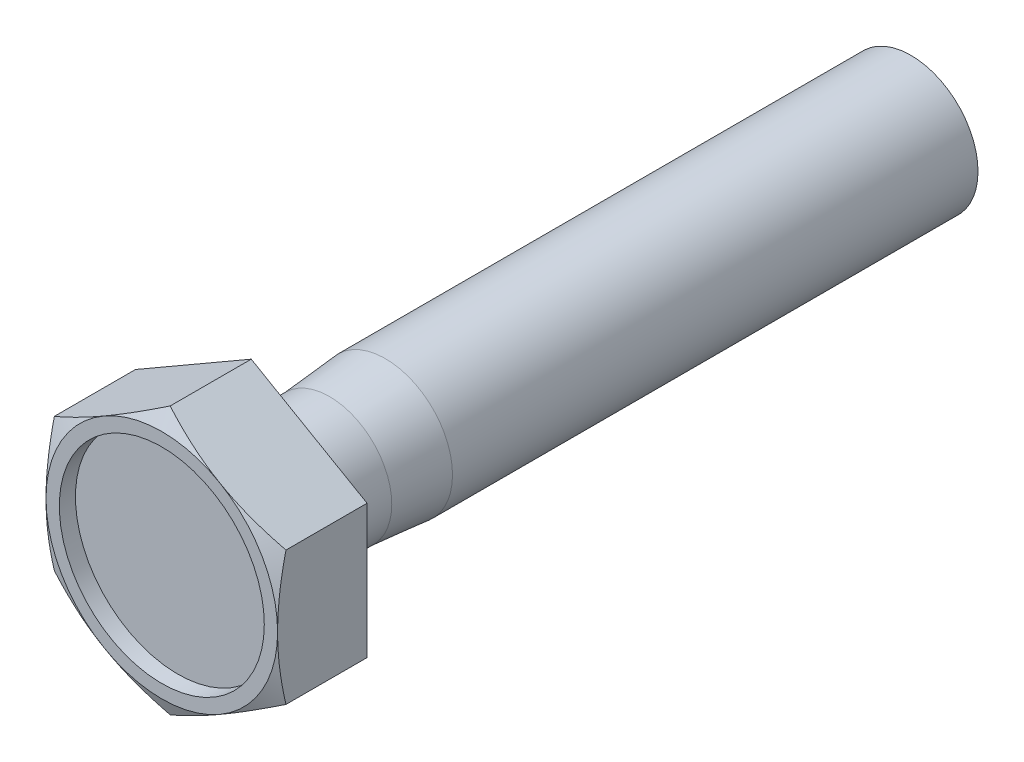
ISO-10303-21;
HEADER;
FILE_DESCRIPTION(('STEP AP214'),'2;1');
FILE_NAME('part.step','',(''),(''),'','','');
FILE_SCHEMA(('AUTOMOTIVE_DESIGN { 1 0 10303 214 1 1 1 1 }'));
ENDSEC;
DATA;
#1=APPLICATION_CONTEXT('core data for automotive mechanical design processes');
#2=APPLICATION_PROTOCOL_DEFINITION('international standard','automotive_design',2000,#1);
#3=PRODUCT_CONTEXT('',#1,'mechanical');
#4=PRODUCT('Part','Part','',(#3));
#5=PRODUCT_RELATED_PRODUCT_CATEGORY('part','',(#4));
#6=PRODUCT_DEFINITION_FORMATION('','',#4);
#7=PRODUCT_DEFINITION_CONTEXT('part definition',#1,'design');
#8=PRODUCT_DEFINITION('design','',#6,#7);
#9=PRODUCT_DEFINITION_SHAPE('','',#8);
#10=(LENGTH_UNIT() NAMED_UNIT(*) SI_UNIT(.MILLI.,.METRE.));
#11=(NAMED_UNIT(*) PLANE_ANGLE_UNIT() SI_UNIT($,.RADIAN.));
#12=(NAMED_UNIT(*) SI_UNIT($,.STERADIAN.) SOLID_ANGLE_UNIT());
#13=UNCERTAINTY_MEASURE_WITH_UNIT(LENGTH_MEASURE(1.E-05),#10,'distance_accuracy_value','');
#14=(GEOMETRIC_REPRESENTATION_CONTEXT(3) GLOBAL_UNCERTAINTY_ASSIGNED_CONTEXT((#13)) GLOBAL_UNIT_ASSIGNED_CONTEXT((#10,
#11,#12)) REPRESENTATION_CONTEXT('',''));
#15=CARTESIAN_POINT('',(0.,0.,0.));
#16=DIRECTION('',(0.,0.,1.));
#17=DIRECTION('',(1.,0.,0.));
#18=AXIS2_PLACEMENT_3D('',#15,#16,#17);
#19=CARTESIAN_POINT('',(2.58941595731547,-1.495,0.));
#20=DIRECTION('',(0.,0.,1.));
#21=DIRECTION('',(1.,0.,0.));
#22=AXIS2_PLACEMENT_3D('',#19,#20,#21);
#23=PLANE('',#22);
#24=CARTESIAN_POINT('',(0.,0.,0.));
#25=DIRECTION('',(0.,0.,1.));
#26=DIRECTION('',(1.,0.,0.));
#27=AXIS2_PLACEMENT_3D('',#24,#25,#26);
#28=CIRCLE('',#27,1.49175);
#29=CARTESIAN_POINT('',(1.49175,0.,0.));
#30=VERTEX_POINT('',#29);
#31=EDGE_CURVE('E12',#30,#30,#28,.T.);
#32=ORIENTED_EDGE('',*,*,#31,.T.);
#33=EDGE_LOOP('',(#32));
#34=FACE_BOUND('',#33,.T.);
#35=DIRECTION('',(0.866025403784439,0.5,0.));
#36=VECTOR('',#35,1.);
#37=CARTESIAN_POINT('',(0.,-2.99,0.));
#38=LINE('',#37,#36);
#39=CARTESIAN_POINT('',(0.,-2.99,0.));
#40=VERTEX_POINT('',#39);
#41=CARTESIAN_POINT('',(2.58941595731547,-1.495,0.));
#42=VERTEX_POINT('',#41);
#43=EDGE_CURVE('E222',#40,#42,#38,.T.);
#44=ORIENTED_EDGE('',*,*,#43,.F.);
#45=DIRECTION('',(0.866025403784439,-0.5,0.));
#46=VECTOR('',#45,1.);
#47=CARTESIAN_POINT('',(-2.58941595731547,-1.495,0.));
#48=LINE('',#47,#46);
#49=CARTESIAN_POINT('',(-2.58941595731547,-1.495,0.));
#50=VERTEX_POINT('',#49);
#51=EDGE_CURVE('E225',#50,#40,#48,.T.);
#52=ORIENTED_EDGE('',*,*,#51,.F.);
#53=DIRECTION('',(0.,-1.,0.));
#54=VECTOR('',#53,1.);
#55=CARTESIAN_POINT('',(-2.58941595731547,1.495,0.));
#56=LINE('',#55,#54);
#57=CARTESIAN_POINT('',(-2.58941595731547,1.495,0.));
#58=VERTEX_POINT('',#57);
#59=EDGE_CURVE('E238',#58,#50,#56,.T.);
#60=ORIENTED_EDGE('',*,*,#59,.F.);
#61=DIRECTION('',(-0.866025403784439,-0.5,0.));
#62=VECTOR('',#61,1.);
#63=CARTESIAN_POINT('',(0.,2.99,0.));
#64=LINE('',#63,#62);
#65=CARTESIAN_POINT('',(0.,2.99,0.));
#66=VERTEX_POINT('',#65);
#67=EDGE_CURVE('E235',#66,#58,#64,.T.);
#68=ORIENTED_EDGE('',*,*,#67,.F.);
#69=DIRECTION('',(-0.866025403784439,0.5,0.));
#70=VECTOR('',#69,1.);
#71=CARTESIAN_POINT('',(2.58941595731547,1.495,0.));
#72=LINE('',#71,#70);
#73=CARTESIAN_POINT('',(2.58941595731547,1.495,0.));
#74=VERTEX_POINT('',#73);
#75=EDGE_CURVE('E231',#74,#66,#72,.T.);
#76=ORIENTED_EDGE('',*,*,#75,.F.);
#77=DIRECTION('',(0.,1.,0.));
#78=VECTOR('',#77,1.);
#79=CARTESIAN_POINT('',(2.58941595731547,-1.495,0.));
#80=LINE('',#79,#78);
#81=EDGE_CURVE('E228',#42,#74,#80,.T.);
#82=ORIENTED_EDGE('',*,*,#81,.F.);
#83=EDGE_LOOP('',(#44,#52,#60,#68,#76,#82));
#84=FACE_BOUND('',#83,.T.);
#85=ADVANCED_FACE('F40',(#34,#84),#23,.F.);
#86=CARTESIAN_POINT('',(0.,-2.99,2.));
#87=DIRECTION('',(-0.5,0.866025403784439,0.));
#88=DIRECTION('',(-0.866025403784439,-0.5,0.));
#89=AXIS2_PLACEMENT_3D('',#86,#87,#88);
#90=PLANE('',#89);
#91=CARTESIAN_POINT('',(-0.000200000000000559,-2.99011547005384,1.81315074547213));
#92=CARTESIAN_POINT('',(0.0781117553372653,-2.94490215702915,1.83423550833601));
#93=CARTESIAN_POINT('',(0.156712474604209,-2.89952201060189,1.85396640188176));
#94=CARTESIAN_POINT('',(0.314503791686666,-2.80842115120854,1.89025045260236));
#95=CARTESIAN_POINT('',(0.393694684751058,-2.76270026778045,1.90680189036158));
#96=CARTESIAN_POINT('',(0.552668224565891,-2.67091685177433,1.93624704480983));
#97=CARTESIAN_POINT('',(0.632451356314811,-2.6248540391823,1.94913731924638));
#98=CARTESIAN_POINT('',(0.792426710600924,-2.53249222532151,1.97078431183186));
#99=CARTESIAN_POINT('',(0.87261885363393,-2.48619326995451,1.97954180452042));
#100=CARTESIAN_POINT('',(1.03161323694773,-2.39439781994865,1.99243942883411));
#101=CARTESIAN_POINT('',(1.11040981511753,-2.34890459433109,1.99667154484949));
#102=CARTESIAN_POINT('',(1.26809391755935,-2.25786563533938,2.00065967331986));
#103=CARTESIAN_POINT('',(1.34698144696711,-2.21231989900011,2.00041541924465));
#104=CARTESIAN_POINT('',(1.50457595498441,-2.12133266737351,1.99546312758893));
#105=CARTESIAN_POINT('',(1.58328303334731,-2.07589111449356,1.99075925095106));
#106=CARTESIAN_POINT('',(1.74040962017896,-1.98517403728946,1.97709025779556));
#107=CARTESIAN_POINT('',(1.81882915415107,-1.93989849824094,1.96812552887589));
#108=CARTESIAN_POINT('',(1.9550576715823,-1.86124692703071,1.94909903740903));
#109=CARTESIAN_POINT('',(2.01296101952873,-1.82781641350686,1.93991797122025));
#110=CARTESIAN_POINT('',(2.12850295257314,-1.76110824736099,1.91957254405888));
#111=CARTESIAN_POINT('',(2.1861415485515,-1.72783058845717,1.90840826535123));
#112=CARTESIAN_POINT('',(2.30159944284048,-1.66117094210936,1.88418163759496));
#113=CARTESIAN_POINT('',(2.35941641727062,-1.62779029635838,1.87110463321703));
#114=CARTESIAN_POINT('',(2.4747445600283,-1.5612055620921,1.84331084881179));
#115=CARTESIAN_POINT('',(2.53225577796,-1.52800144493781,1.82859434383544));
#116=CARTESIAN_POINT('',(2.58961595731547,-1.49488452994616,1.81315074547213));
#117=B_SPLINE_CURVE_WITH_KNOTS('',3,(#91,#92,#93,#94,#95,#96,#97,#98,#99,#100,#101,#102,#103,
#104,#105,#106,#107,#108,#109,#110,#111,#112,#113,#114,#115,#116),.UNSPECIFIED.,.F.,.F.,(4,2,2,
2,2,2,2,2,2,2,2,2,4),(0.,0.278572599021923,0.557295425608173,0.836279448440925,1.11521116508063,
1.38835866824515,1.6615224350996,1.93443158369264,2.20731591124514,2.40975158276458,
2.61217885908091,2.81624738167224,3.02028172009845),.UNSPECIFIED.);
#118=CARTESIAN_POINT('',(0.,-2.99,1.81320459316152));
#119=VERTEX_POINT('',#118);
#120=CARTESIAN_POINT('',(1.29470797865774,-2.2425,2.));
#121=VERTEX_POINT('',#120);
#122=EDGE_CURVE('E230',#119,#121,#117,.T.);
#123=ORIENTED_EDGE('',*,*,#122,.F.);
#124=DIRECTION('',(0.,0.,-1.));
#125=VECTOR('',#124,1.);
#126=CARTESIAN_POINT('',(0.,-2.99,2.));
#127=LINE('',#126,#125);
#128=EDGE_CURVE('E242',#119,#40,#127,.T.);
#129=ORIENTED_EDGE('',*,*,#128,.T.);
#130=ORIENTED_EDGE('',*,*,#43,.T.);
#131=DIRECTION('',(0.,0.,-1.));
#132=VECTOR('',#131,1.);
#133=CARTESIAN_POINT('',(2.58941595731547,-1.495,2.));
#134=LINE('',#133,#132);
#135=CARTESIAN_POINT('',(2.58941595731547,-1.49500000000002,1.81320459316154));
#136=VERTEX_POINT('',#135);
#137=EDGE_CURVE('E251',#136,#42,#134,.T.);
#138=ORIENTED_EDGE('',*,*,#137,.F.);
#139=EDGE_CURVE('E175',#121,#136,#117,.T.);
#140=ORIENTED_EDGE('',*,*,#139,.F.);
#141=EDGE_LOOP('',(#123,#129,#130,#138,#140));
#142=FACE_BOUND('',#141,.T.);
#143=ADVANCED_FACE('F210',(#142),#90,.F.);
#144=CARTESIAN_POINT('',(2.58941595731547,-1.495,2.));
#145=DIRECTION('',(-1.,0.,0.));
#146=DIRECTION('',(0.,-1.,0.));
#147=AXIS2_PLACEMENT_3D('',#144,#145,#146);
#148=PLANE('',#147);
#149=CARTESIAN_POINT('',(2.58941595731547,-4.05949187050648,0.962177416281556));
#150=CARTESIAN_POINT('',(2.58941595731547,-3.94192425881493,1.00838483216717));
#151=CARTESIAN_POINT('',(2.58941595731547,-3.82416444986135,1.05411185272814));
#152=CARTESIAN_POINT('',(2.58941595731547,-3.58816211272699,1.14433123663302));
#153=CARTESIAN_POINT('',(2.58941595731547,-3.4699195451137,1.18882349670777));
#154=CARTESIAN_POINT('',(2.58941595731547,-3.23251482185504,1.27642383820413));
#155=CARTESIAN_POINT('',(2.58941595731547,-3.1133509671602,1.31952733109694));
#156=CARTESIAN_POINT('',(2.58941595731547,-2.87434625236034,1.40382271549667));
#157=CARTESIAN_POINT('',(2.58941595731547,-2.75450539046578,1.44501460194796));
#158=CARTESIAN_POINT('',(2.58941595731547,-2.51587025363248,1.52437224505162));
#159=CARTESIAN_POINT('',(2.58941595731547,-2.39708829290789,1.56257484180808));
#160=CARTESIAN_POINT('',(2.58941595731547,-2.15861570305668,1.63602300676433));
#161=CARTESIAN_POINT('',(2.58941595731547,-2.03892512580186,1.67126874240381));
#162=CARTESIAN_POINT('',(2.58941595731547,-1.79860608947482,1.73798468167914));
#163=CARTESIAN_POINT('',(2.58941595731547,-1.67797862676659,1.76945843184286));
#164=CARTESIAN_POINT('',(2.58941595731547,-1.43555387668353,1.82770703865638));
#165=CARTESIAN_POINT('',(2.58941595731547,-1.31375625194185,1.85448049451254));
#166=CARTESIAN_POINT('',(2.58941595731547,-1.02368725831387,1.91100450904459));
#167=CARTESIAN_POINT('',(2.58941595731547,-0.854889983062962,1.93819312846918));
#168=CARTESIAN_POINT('',(2.58941595731547,-0.600503304155968,1.9685472343523));
#169=CARTESIAN_POINT('',(2.58941595731547,-0.515522442730212,1.97692664525511));
#170=CARTESIAN_POINT('',(2.58941595731547,-0.345278080402542,1.98994142195949));
#171=CARTESIAN_POINT('',(2.58941595731547,-0.260014614488341,1.99457723503932));
#172=CARTESIAN_POINT('',(2.58941595731547,-0.0888523157621135,1.99994961267286));
#173=CARTESIAN_POINT('',(2.58941595731547,-0.00295273896992577,2.00066262774147));
#174=CARTESIAN_POINT('',(2.58941595731547,0.168783937451278,1.99809962511386));
#175=CARTESIAN_POINT('',(2.58941595731547,0.254621038601308,1.99482370801898));
#176=CARTESIAN_POINT('',(2.58941595731547,0.426075303303482,1.9844054623946));
#177=CARTESIAN_POINT('',(2.58941595731547,0.511692420367339,1.97726237490939));
#178=CARTESIAN_POINT('',(2.58941595731547,0.682531233082829,1.95936225508539));
#179=CARTESIAN_POINT('',(2.58941595731547,0.767752970102243,1.94860560988405));
#180=CARTESIAN_POINT('',(2.58941595731547,1.14528354421324,1.89354263045641));
#181=CARTESIAN_POINT('',(2.58941595731547,1.43504432812931,1.83145796907614));
#182=CARTESIAN_POINT('',(2.58941595731547,1.86488669512967,1.72049094983876));
#183=CARTESIAN_POINT('',(2.58941595731547,2.0075340805957,1.68047048460236));
#184=CARTESIAN_POINT('',(2.58941595731547,2.29148742048406,1.59589666765467));
#185=CARTESIAN_POINT('',(2.58941595731547,2.43279355681267,1.55134394051782));
#186=CARTESIAN_POINT('',(2.58941595731547,2.71546676566653,1.45842517393483));
#187=CARTESIAN_POINT('',(2.58941595731547,2.85682401182303,1.41002976487161));
#188=CARTESIAN_POINT('',(2.58941595731547,3.13860785576299,1.31059159760953));
#189=CARTESIAN_POINT('',(2.58941595731547,3.27903442266437,1.25954875205375));
#190=CARTESIAN_POINT('',(2.58941595731547,3.55898916615624,1.1554805902979));
#191=CARTESIAN_POINT('',(2.58941595731547,3.69851809464803,1.10245728719732));
#192=CARTESIAN_POINT('',(2.58941595731547,3.97696309955221,0.994822558189772));
#193=CARTESIAN_POINT('',(2.58941595731547,4.11587916599807,0.940211106564708));
#194=CARTESIAN_POINT('',(2.58941595731547,4.53143813396891,0.774690977784609));
#195=CARTESIAN_POINT('',(2.58941595731547,4.80734109769616,0.661926825284794));
#196=CARTESIAN_POINT('',(2.58941595731547,5.35788393487722,0.433167457152506));
#197=CARTESIAN_POINT('',(2.58941595731547,5.63252344094687,0.317171363366641));
#198=CARTESIAN_POINT('',(2.58941595731547,6.17596158226178,0.0850893691332576));
#199=CARTESIAN_POINT('',(2.58941595731547,6.4447767985795,-0.0309577858859056));
#200=CARTESIAN_POINT('',(2.58941595731547,6.98164615260976,-0.264556403945473));
#201=CARTESIAN_POINT('',(2.58941595731547,7.24970051548374,-0.382107349017134));
#202=CARTESIAN_POINT('',(2.58941595731547,7.51753495297041,-0.500147868118493));
#203=B_SPLINE_CURVE_WITH_KNOTS('',3,(#149,#150,#151,#152,#153,#154,#155,#156,#157,#158,#159,
#160,#161,#162,#163,#164,#165,#166,#167,#168,#169,#170,#171,#172,#173,#174,#175,#176,#177,#178,
#179,#180,#181,#182,#183,#184,#185,#186,#187,#188,#189,#190,#191,#192,#193,#194,#195,#196,#197,
#198,#199,#200,#201,#202),.UNSPECIFIED.,.F.,.F.,(4,2,2,2,2,2,2,2,2,2,2,2,2,2,2,2,2,2,2,2,2,2,2,
2,2,2,4),(0.,0.378969910717856,0.757971421636924,1.13811809538307,1.51826577444642,
1.89255771405653,2.26682844411885,2.64074446654391,3.01477173589597,3.52714867958541,
3.78325839827987,4.03933751292185,4.29695226727309,4.55456052468475,4.81221935762173,
5.06985059515373,5.95667460818366,6.40114264268393,6.84554950943012,7.29375936304856,
7.74198401557597,8.18976483395494,8.6375529076346,9.53168848061554,10.4260694157637,
11.3044469245205,12.1825296204247),.UNSPECIFIED.);
#204=CARTESIAN_POINT('',(2.58941595731547,0.,2.));
#205=VERTEX_POINT('',#204);
#206=EDGE_CURVE('E334',#136,#205,#203,.T.);
#207=ORIENTED_EDGE('',*,*,#206,.F.);
#208=ORIENTED_EDGE('',*,*,#137,.T.);
#209=ORIENTED_EDGE('',*,*,#81,.T.);
#210=DIRECTION('',(0.,0.,-1.));
#211=VECTOR('',#210,1.);
#212=CARTESIAN_POINT('',(2.58941595731547,1.495,2.));
#213=LINE('',#212,#211);
#214=CARTESIAN_POINT('',(2.58941595731547,1.495,1.81320459316152));
#215=VERTEX_POINT('',#214);
#216=EDGE_CURVE('E249',#215,#74,#213,.T.);
#217=ORIENTED_EDGE('',*,*,#216,.F.);
#218=EDGE_CURVE('E116',#205,#215,#203,.T.);
#219=ORIENTED_EDGE('',*,*,#218,.F.);
#220=EDGE_LOOP('',(#207,#208,#209,#217,#219));
#221=FACE_BOUND('',#220,.T.);
#222=ADVANCED_FACE('F208',(#221),#148,.F.);
#223=CARTESIAN_POINT('',(2.58941595731547,1.495,2.));
#224=DIRECTION('',(-0.5,-0.866025403784439,0.));
#225=DIRECTION('',(0.866025403784439,-0.5,0.));
#226=AXIS2_PLACEMENT_3D('',#223,#224,#225);
#227=PLANE('',#226);
#228=CARTESIAN_POINT('',(2.58961595731547,1.49488452994616,1.81315074547213));
#229=CARTESIAN_POINT('',(2.51130420197821,1.54009784297085,1.83423550833601));
#230=CARTESIAN_POINT('',(2.43270348271126,1.58547798939812,1.85396640188176));
#231=CARTESIAN_POINT('',(2.2749121656288,1.67657884879146,1.89025045260236));
#232=CARTESIAN_POINT('',(2.19572127256441,1.72229973221955,1.90680189036158));
#233=CARTESIAN_POINT('',(2.03674773274958,1.81408314822567,1.93624704480983));
#234=CARTESIAN_POINT('',(1.95696460100066,1.8601459608177,1.94913731924638));
#235=CARTESIAN_POINT('',(1.79698924671455,1.9525077746785,1.97078431183186));
#236=CARTESIAN_POINT('',(1.71679710368154,1.99880673004549,1.97954180452042));
#237=CARTESIAN_POINT('',(1.55780272036774,2.09060218005135,1.99243942883411));
#238=CARTESIAN_POINT('',(1.47900614219794,2.13609540566891,1.99667154484949));
#239=CARTESIAN_POINT('',(1.32132203975612,2.22713436466062,2.00065967331986));
#240=CARTESIAN_POINT('',(1.24243451034836,2.2726801009999,2.00041541924465));
#241=CARTESIAN_POINT('',(1.08484000233106,2.36366733262649,1.99546312758893));
#242=CARTESIAN_POINT('',(1.00613292396816,2.40910888550644,1.99075925095106));
#243=CARTESIAN_POINT('',(0.849006337136511,2.49982596271054,1.97709025779556));
#244=CARTESIAN_POINT('',(0.770586803164397,2.54510150175906,1.96812552887589));
#245=CARTESIAN_POINT('',(0.634358285733167,2.62375307296929,1.94909903740903));
#246=CARTESIAN_POINT('',(0.576454937786736,2.65718358649314,1.93991797122025));
#247=CARTESIAN_POINT('',(0.460913004742333,2.72389175263902,1.91957254405888));
#248=CARTESIAN_POINT('',(0.403274408763974,2.75716941154283,1.90840826535123));
#249=CARTESIAN_POINT('',(0.28781651447499,2.82382905789065,1.88418163759496));
#250=CARTESIAN_POINT('',(0.229999540044849,2.85720970364162,1.87110463321703));
#251=CARTESIAN_POINT('',(0.114671397287173,2.9237944379079,1.84331084881178));
#252=CARTESIAN_POINT('',(0.0571601793554716,2.95699855506219,1.82859434383544));
#253=CARTESIAN_POINT('',(-0.000200000000000025,2.99011547005384,1.81315074547213));
#254=B_SPLINE_CURVE_WITH_KNOTS('',3,(#228,#229,#230,#231,#232,#233,#234,#235,#236,#237,#238,
#239,#240,#241,#242,#243,#244,#245,#246,#247,#248,#249,#250,#251,#252,#253),.UNSPECIFIED.,.F.,
.F.,(4,2,2,2,2,2,2,2,2,2,2,2,4),(0.,0.278572599021923,0.557295425608173,0.836279448440926,
1.11521116508063,1.38835866824515,1.6615224350996,1.93443158369264,2.20731591124514,
2.40975158276458,2.61217885908091,2.81624738167224,3.02028172009845),.UNSPECIFIED.);
#255=CARTESIAN_POINT('',(1.29470797865774,2.2425,2.));
#256=VERTEX_POINT('',#255);
#257=EDGE_CURVE('E112',#215,#256,#254,.T.);
#258=ORIENTED_EDGE('',*,*,#257,.F.);
#259=ORIENTED_EDGE('',*,*,#216,.T.);
#260=ORIENTED_EDGE('',*,*,#75,.T.);
#261=DIRECTION('',(0.,0.,-1.));
#262=VECTOR('',#261,1.);
#263=CARTESIAN_POINT('',(0.,2.99,2.));
#264=LINE('',#263,#262);
#265=CARTESIAN_POINT('',(0.,2.99,1.81320459316152));
#266=VERTEX_POINT('',#265);
#267=EDGE_CURVE('E142',#266,#66,#264,.T.);
#268=ORIENTED_EDGE('',*,*,#267,.F.);
#269=EDGE_CURVE('E120',#256,#266,#254,.T.);
#270=ORIENTED_EDGE('',*,*,#269,.F.);
#271=EDGE_LOOP('',(#258,#259,#260,#268,#270));
#272=FACE_BOUND('',#271,.T.);
#273=ADVANCED_FACE('F140',(#272),#227,.F.);
#274=CARTESIAN_POINT('',(0.,2.99,2.));
#275=DIRECTION('',(0.5,-0.866025403784439,0.));
#276=DIRECTION('',(0.866025403784439,0.5,0.));
#277=AXIS2_PLACEMENT_3D('',#274,#275,#276);
#278=PLANE('',#277);
#279=CARTESIAN_POINT('',(0.000200000000000231,2.99011547005384,1.81315074547213));
#280=CARTESIAN_POINT('',(-0.0781117553372655,2.94490215702916,1.83423550833601));
#281=CARTESIAN_POINT('',(-0.156712474604209,2.89952201060189,1.85396640188176));
#282=CARTESIAN_POINT('',(-0.314503791686666,2.80842115120855,1.89025045260236));
#283=CARTESIAN_POINT('',(-0.393694684751058,2.76270026778045,1.90680189036158));
#284=CARTESIAN_POINT('',(-0.552668224565891,2.67091685177433,1.93624704480983));
#285=CARTESIAN_POINT('',(-0.632451356314811,2.6248540391823,1.94913731924638));
#286=CARTESIAN_POINT('',(-0.792426710600925,2.53249222532151,1.97078431183186));
#287=CARTESIAN_POINT('',(-0.872618853633931,2.48619326995451,1.97954180452042));
#288=CARTESIAN_POINT('',(-1.03161323694773,2.39439781994865,1.99243942883411));
#289=CARTESIAN_POINT('',(-1.11040981511753,2.34890459433109,1.99667154484949));
#290=CARTESIAN_POINT('',(-1.26809391755935,2.25786563533938,2.00065967331986));
#291=CARTESIAN_POINT('',(-1.34698144696711,2.21231989900011,2.00041541924465));
#292=CARTESIAN_POINT('',(-1.50457595498441,2.12133266737352,1.99546312758893));
#293=CARTESIAN_POINT('',(-1.58328303334732,2.07589111449356,1.99075925095106));
#294=CARTESIAN_POINT('',(-1.74040962017896,1.98517403728946,1.97709025779556));
#295=CARTESIAN_POINT('',(-1.81882915415107,1.93989849824094,1.96812552887589));
#296=CARTESIAN_POINT('',(-1.9550576715823,1.86124692703072,1.94909903740903));
#297=CARTESIAN_POINT('',(-2.01296101952874,1.82781641350686,1.93991797122025));
#298=CARTESIAN_POINT('',(-2.12850295257314,1.76110824736099,1.91957254405888));
#299=CARTESIAN_POINT('',(-2.1861415485515,1.72783058845717,1.90840826535123));
#300=CARTESIAN_POINT('',(-2.30159944284048,1.66117094210936,1.88418163759496));
#301=CARTESIAN_POINT('',(-2.35941641727062,1.62779029635839,1.87110463321703));
#302=CARTESIAN_POINT('',(-2.4747445600283,1.5612055620921,1.84331084881178));
#303=CARTESIAN_POINT('',(-2.53225577796,1.52800144493781,1.82859434383544));
#304=CARTESIAN_POINT('',(-2.58961595731547,1.49488452994616,1.81315074547213));
#305=B_SPLINE_CURVE_WITH_KNOTS('',3,(#279,#280,#281,#282,#283,#284,#285,#286,#287,#288,#289,
#290,#291,#292,#293,#294,#295,#296,#297,#298,#299,#300,#301,#302,#303,#304),.UNSPECIFIED.,.F.,
.F.,(4,2,2,2,2,2,2,2,2,2,2,2,4),(0.,0.278572599021923,0.557295425608173,0.836279448440926,
1.11521116508063,1.38835866824515,1.6615224350996,1.93443158369264,2.20731591124514,
2.40975158276458,2.61217885908092,2.81624738167224,3.02028172009845),.UNSPECIFIED.);
#306=CARTESIAN_POINT('',(-1.29470797865774,2.2425,2.));
#307=VERTEX_POINT('',#306);
#308=EDGE_CURVE('E127',#266,#307,#305,.T.);
#309=ORIENTED_EDGE('',*,*,#308,.F.);
#310=ORIENTED_EDGE('',*,*,#267,.T.);
#311=ORIENTED_EDGE('',*,*,#67,.T.);
#312=DIRECTION('',(0.,0.,-1.));
#313=VECTOR('',#312,1.);
#314=CARTESIAN_POINT('',(-2.58941595731547,1.495,2.));
#315=LINE('',#314,#313);
#316=CARTESIAN_POINT('',(-2.58941595731547,1.495,1.81320459316152));
#317=VERTEX_POINT('',#316);
#318=EDGE_CURVE('E246',#317,#58,#315,.T.);
#319=ORIENTED_EDGE('',*,*,#318,.F.);
#320=EDGE_CURVE('E143',#307,#317,#305,.T.);
#321=ORIENTED_EDGE('',*,*,#320,.F.);
#322=EDGE_LOOP('',(#309,#310,#311,#319,#321));
#323=FACE_BOUND('',#322,.T.);
#324=ADVANCED_FACE('F199',(#323),#278,.F.);
#325=CARTESIAN_POINT('',(-2.58941595731547,1.495,2.));
#326=DIRECTION('',(1.,0.,0.));
#327=DIRECTION('',(0.,0.,-1.));
#328=AXIS2_PLACEMENT_3D('',#325,#326,#327);
#329=PLANE('',#328);
#330=CARTESIAN_POINT('',(-2.58941595731547,-4.05949186860814,0.962177417027866));
#331=CARTESIAN_POINT('',(-2.58941595731547,-3.94192425698689,1.00838483287961));
#332=CARTESIAN_POINT('',(-2.58941595731547,-3.82416444810366,1.05411185340676));
#333=CARTESIAN_POINT('',(-2.58941595731547,-3.5881621111102,1.1443312372443));
#334=CARTESIAN_POINT('',(-2.58941595731547,-3.46991954356746,1.18882349728553));
#335=CARTESIAN_POINT('',(-2.58941595731547,-3.23251482045085,1.27642383871505));
#336=CARTESIAN_POINT('',(-2.58941595731547,-3.11335096582753,1.31952733157456));
#337=CARTESIAN_POINT('',(-2.58941595731547,-2.8743462511711,1.40382271590851));
#338=CARTESIAN_POINT('',(-2.58941595731547,-2.75450538934847,1.44501460232732));
#339=CARTESIAN_POINT('',(-2.58941595731547,-2.51587025265897,1.52437224536768));
#340=CARTESIAN_POINT('',(-2.58941595731547,-2.39708829200627,1.56257484209331));
#341=CARTESIAN_POINT('',(-2.58941595731547,-2.15861570229962,1.63602300698996));
#342=CARTESIAN_POINT('',(-2.58941595731547,-2.0389251251175,1.67126874260066));
#343=CARTESIAN_POINT('',(-2.58941595731547,-1.79860608893666,1.73798468182169));
#344=CARTESIAN_POINT('',(-2.58941595731547,-1.67797862630193,1.76945843195987));
#345=CARTESIAN_POINT('',(-2.58941595731547,-1.43555387636721,1.82770703872702));
#346=CARTESIAN_POINT('',(-2.58941595731547,-1.31375625170039,1.85448049456235));
#347=CARTESIAN_POINT('',(-2.58941595731547,-1.02368725811303,1.91100450907998));
#348=CARTESIAN_POINT('',(-2.58941595731547,-0.854889982826672,1.93819312850486));
#349=CARTESIAN_POINT('',(-2.58941595731547,-0.600503303866358,1.9685472343831));
#350=CARTESIAN_POINT('',(-2.58941595731547,-0.515522442422803,1.9769266452834));
#351=CARTESIAN_POINT('',(-2.58941595731547,-0.345278080059608,1.98994142198092));
#352=CARTESIAN_POINT('',(-2.58941595731547,-0.260014614127681,1.99457723505642));
#353=CARTESIAN_POINT('',(-2.58941595731547,-0.0888523153654089,1.9999496126795));
#354=CARTESIAN_POINT('',(-2.58941595731547,-0.00295273855490324,2.00066262774196));
#355=CARTESIAN_POINT('',(-2.58941595731547,0.168783937902589,1.99809962510044));
#356=CARTESIAN_POINT('',(-2.58941595731547,0.25462103907059,1.99482370799779));
#357=CARTESIAN_POINT('',(-2.58941595731547,0.426075303808422,1.98440546235659));
#358=CARTESIAN_POINT('',(-2.58941595731547,0.511692420889966,1.97726237486232));
#359=CARTESIAN_POINT('',(-2.58941595731547,0.682531233640411,1.95936225501927));
#360=CARTESIAN_POINT('',(-2.58941595731547,0.767752970677093,1.94860560980795));
#361=CARTESIAN_POINT('',(-2.58941595731547,1.14528354480664,1.8935426303432));
#362=CARTESIAN_POINT('',(-2.58941595731547,1.43504432872298,1.83145796894066));
#363=CARTESIAN_POINT('',(-2.58941595731547,1.86488669572438,1.72049094967633));
#364=CARTESIAN_POINT('',(-2.58941595731547,2.00753408119078,1.68047048443205));
#365=CARTESIAN_POINT('',(-2.58941595731547,2.29148742108011,1.59589666747021));
#366=CARTESIAN_POINT('',(-2.58941595731547,2.43279355740933,1.55134394032709));
#367=CARTESIAN_POINT('',(-2.58941595731547,2.71546676626386,1.45842517373303));
#368=CARTESIAN_POINT('',(-2.58941595731547,2.85682401242042,1.41002976466503));
#369=CARTESIAN_POINT('',(-2.58941595731547,3.13860785636076,1.31059159739435));
#370=CARTESIAN_POINT('',(-2.58941595731547,3.27903442326246,1.25954875183475));
#371=CARTESIAN_POINT('',(-2.58941595731547,3.55898916675524,1.15548059007192));
#372=CARTESIAN_POINT('',(-2.58941595731547,3.69851809524761,1.10245728696818));
#373=CARTESIAN_POINT('',(-2.58941595731547,3.97696310015316,0.994822557954846));
#374=CARTESIAN_POINT('',(-2.58941595731547,4.11587916659978,0.940211106327144));
#375=CARTESIAN_POINT('',(-2.58941595731547,4.53143813455558,0.774690977546692));
#376=CARTESIAN_POINT('',(-2.58941595731547,4.80734109826735,0.661926825050042));
#377=CARTESIAN_POINT('',(-2.58941595731547,5.35788393541789,0.433167456925289));
#378=CARTESIAN_POINT('',(-2.58941595731547,5.63252344147249,0.317171363143796));
#379=CARTESIAN_POINT('',(-2.58941595731547,6.17596158276131,0.0850893689183169));
#380=CARTESIAN_POINT('',(-2.58941595731547,6.44477679906798,-0.0309577860973536));
#381=CARTESIAN_POINT('',(-2.58941595731547,6.98164615307634,-0.264556404149534));
#382=CARTESIAN_POINT('',(-2.58941595731547,7.24970051593948,-0.382107349217301));
#383=CARTESIAN_POINT('',(-2.58941595731547,7.51753495341535,-0.500147868314663));
#384=B_SPLINE_CURVE_WITH_KNOTS('',3,(#330,#331,#332,#333,#334,#335,#336,#337,#338,#339,#340,
#341,#342,#343,#344,#345,#346,#347,#348,#349,#350,#351,#352,#353,#354,#355,#356,#357,#358,#359,
#360,#361,#362,#363,#364,#365,#366,#367,#368,#369,#370,#371,#372,#373,#374,#375,#376,#377,#378,
#379,#380,#381,#382,#383),.UNSPECIFIED.,.F.,.F.,(4,2,2,2,2,2,2,2,2,2,2,2,2,2,2,2,2,2,2,2,2,2,2,
2,2,2,4),(0.,0.378969910484387,0.757971421169957,1.13811809468038,1.518265773508,
1.89255771288454,2.26682844271332,2.64074446490577,3.01477173402528,3.52714867781939,
3.78325839656619,4.0393375112605,4.29695226566648,4.55456052313285,4.81221935612494,
5.06985059371207,5.95667460675802,6.40114264126575,6.84554950801941,7.29375936164268,
7.74198401417491,8.18976483255893,8.63755290624361,9.53168847917801,10.4260694142795,
11.3044469230016,12.1825296188714),.UNSPECIFIED.);
#385=CARTESIAN_POINT('',(-2.58941595731547,0.,2.));
#386=VERTEX_POINT('',#385);
#387=EDGE_CURVE('E193',#317,#386,#384,.F.);
#388=ORIENTED_EDGE('',*,*,#387,.F.);
#389=ORIENTED_EDGE('',*,*,#318,.T.);
#390=ORIENTED_EDGE('',*,*,#59,.T.);
#391=DIRECTION('',(0.,0.,-1.));
#392=VECTOR('',#391,1.);
#393=CARTESIAN_POINT('',(-2.58941595731547,-1.495,2.));
#394=LINE('',#393,#392);
#395=CARTESIAN_POINT('',(-2.58941595731547,-1.495,1.81320459316152));
#396=VERTEX_POINT('',#395);
#397=EDGE_CURVE('E244',#396,#50,#394,.T.);
#398=ORIENTED_EDGE('',*,*,#397,.F.);
#399=EDGE_CURVE('E188',#386,#396,#384,.F.);
#400=ORIENTED_EDGE('',*,*,#399,.F.);
#401=EDGE_LOOP('',(#388,#389,#390,#398,#400));
#402=FACE_BOUND('',#401,.T.);
#403=ADVANCED_FACE('F195',(#402),#329,.F.);
#404=CARTESIAN_POINT('',(-2.58941595731547,-1.495,2.));
#405=DIRECTION('',(0.5,0.866025403784439,0.));
#406=DIRECTION('',(-0.866025403784439,0.5,0.));
#407=AXIS2_PLACEMENT_3D('',#404,#405,#406);
#408=PLANE('',#407);
#409=CARTESIAN_POINT('',(-2.58961595731547,-1.49488452994616,1.81315074547213));
#410=CARTESIAN_POINT('',(-2.51130420197821,-1.54009784297085,1.83423550833601));
#411=CARTESIAN_POINT('',(-2.43270348271126,-1.58547798939811,1.85396640188176));
#412=CARTESIAN_POINT('',(-2.2749121656288,-1.67657884879146,1.89025045260236));
#413=CARTESIAN_POINT('',(-2.19572127256441,-1.72229973221955,1.90680189036158));
#414=CARTESIAN_POINT('',(-2.03674773274958,-1.81408314822567,1.93624704480983));
#415=CARTESIAN_POINT('',(-1.95696460100066,-1.8601459608177,1.94913731924638));
#416=CARTESIAN_POINT('',(-1.79698924671455,-1.95250777467849,1.97078431183186));
#417=CARTESIAN_POINT('',(-1.71679710368154,-1.99880673004549,1.97954180452042));
#418=CARTESIAN_POINT('',(-1.55780272036774,-2.09060218005135,1.99243942883411));
#419=CARTESIAN_POINT('',(-1.47900614219794,-2.13609540566891,1.99667154484949));
#420=CARTESIAN_POINT('',(-1.32132203975612,-2.22713436466062,2.00065967331986));
#421=CARTESIAN_POINT('',(-1.24243451034836,-2.27268010099989,2.00041541924465));
#422=CARTESIAN_POINT('',(-1.08484000233107,-2.36366733262649,1.99546312758893));
#423=CARTESIAN_POINT('',(-1.00613292396816,-2.40910888550644,1.99075925095106));
#424=CARTESIAN_POINT('',(-0.849006337136511,-2.49982596271054,1.97709025779556));
#425=CARTESIAN_POINT('',(-0.770586803164397,-2.54510150175906,1.96812552887589));
#426=CARTESIAN_POINT('',(-0.634358285733168,-2.62375307296929,1.94909903740903));
#427=CARTESIAN_POINT('',(-0.576454937786736,-2.65718358649314,1.93991797122025));
#428=CARTESIAN_POINT('',(-0.460913004742333,-2.72389175263901,1.91957254405888));
#429=CARTESIAN_POINT('',(-0.403274408763975,-2.75716941154283,1.90840826535123));
#430=CARTESIAN_POINT('',(-0.28781651447499,-2.82382905789064,1.88418163759496));
#431=CARTESIAN_POINT('',(-0.229999540044849,-2.85720970364162,1.87110463321703));
#432=CARTESIAN_POINT('',(-0.114671397287174,-2.9237944379079,1.84331084881179));
#433=CARTESIAN_POINT('',(-0.0571601793554719,-2.95699855506219,1.82859434383544));
#434=CARTESIAN_POINT('',(0.000199999999999698,-2.99011547005384,1.81315074547213));
#435=B_SPLINE_CURVE_WITH_KNOTS('',3,(#409,#410,#411,#412,#413,#414,#415,#416,#417,#418,#419,
#420,#421,#422,#423,#424,#425,#426,#427,#428,#429,#430,#431,#432,#433,#434),.UNSPECIFIED.,.F.,
.F.,(4,2,2,2,2,2,2,2,2,2,2,2,4),(0.,0.278572599021923,0.557295425608174,0.836279448440927,
1.11521116508063,1.38835866824515,1.6615224350996,1.93443158369264,2.20731591124514,
2.40975158276458,2.61217885908092,2.81624738167224,3.02028172009845),.UNSPECIFIED.);
#436=CARTESIAN_POINT('',(-1.29470797865773,-2.2425,2.));
#437=VERTEX_POINT('',#436);
#438=EDGE_CURVE('E194',#396,#437,#435,.T.);
#439=ORIENTED_EDGE('',*,*,#438,.F.);
#440=ORIENTED_EDGE('',*,*,#397,.T.);
#441=ORIENTED_EDGE('',*,*,#51,.T.);
#442=ORIENTED_EDGE('',*,*,#128,.F.);
#443=EDGE_CURVE('E136',#437,#119,#435,.T.);
#444=ORIENTED_EDGE('',*,*,#443,.F.);
#445=EDGE_LOOP('',(#439,#440,#441,#442,#444));
#446=FACE_BOUND('',#445,.T.);
#447=ADVANCED_FACE('F198',(#446),#408,.F.);
#448=CARTESIAN_POINT('',(0.,0.,2.));
#449=DIRECTION('',(0.,0.,-1.));
#450=DIRECTION('',(1.,0.,0.));
#451=AXIS2_PLACEMENT_3D('',#448,#449,#450);
#452=CONICAL_SURFACE('',#451,2.58941595731547,1.13446401379632);
#453=ORIENTED_EDGE('',*,*,#139,.T.);
#454=ORIENTED_EDGE('',*,*,#206,.T.);
#455=CARTESIAN_POINT('',(0.,0.,2.));
#456=DIRECTION('',(0.,0.,1.));
#457=DIRECTION('',(1.,0.,0.));
#458=AXIS2_PLACEMENT_3D('',#455,#456,#457);
#459=CIRCLE('',#458,2.58941595731547);
#460=EDGE_CURVE('E132',#121,#205,#459,.T.);
#461=ORIENTED_EDGE('',*,*,#460,.F.);
#462=EDGE_LOOP('',(#453,#454,#461));
#463=FACE_BOUND('',#462,.T.);
#464=ADVANCED_FACE('F168',(#463),#452,.T.);
#465=ORIENTED_EDGE('',*,*,#122,.T.);
#466=EDGE_CURVE('E252',#437,#121,#459,.T.);
#467=ORIENTED_EDGE('',*,*,#466,.F.);
#468=ORIENTED_EDGE('',*,*,#443,.T.);
#469=EDGE_LOOP('',(#465,#467,#468));
#470=FACE_BOUND('',#469,.T.);
#471=ADVANCED_FACE('F162',(#470),#452,.T.);
#472=ORIENTED_EDGE('',*,*,#399,.T.);
#473=ORIENTED_EDGE('',*,*,#438,.T.);
#474=EDGE_CURVE('E64',#386,#437,#459,.T.);
#475=ORIENTED_EDGE('',*,*,#474,.F.);
#476=EDGE_LOOP('',(#472,#473,#475));
#477=FACE_BOUND('',#476,.T.);
#478=ADVANCED_FACE('F167',(#477),#452,.T.);
#479=ORIENTED_EDGE('',*,*,#320,.T.);
#480=ORIENTED_EDGE('',*,*,#387,.T.);
#481=EDGE_CURVE('E130',#307,#386,#459,.T.);
#482=ORIENTED_EDGE('',*,*,#481,.F.);
#483=EDGE_LOOP('',(#479,#480,#482));
#484=FACE_BOUND('',#483,.T.);
#485=ADVANCED_FACE('F325',(#484),#452,.T.);
#486=ORIENTED_EDGE('',*,*,#269,.T.);
#487=ORIENTED_EDGE('',*,*,#308,.T.);
#488=EDGE_CURVE('E124',#256,#307,#459,.T.);
#489=ORIENTED_EDGE('',*,*,#488,.F.);
#490=EDGE_LOOP('',(#486,#487,#489));
#491=FACE_BOUND('',#490,.T.);
#492=ADVANCED_FACE('F125',(#491),#452,.T.);
#493=ORIENTED_EDGE('',*,*,#218,.T.);
#494=ORIENTED_EDGE('',*,*,#257,.T.);
#495=CARTESIAN_POINT('',(0.,0.,2.));
#496=DIRECTION('',(0.,0.,1.));
#497=DIRECTION('',(1.,0.,0.));
#498=AXIS2_PLACEMENT_3D('',#495,#496,#497);
#499=CIRCLE('',#498,2.58941595731547);
#500=EDGE_CURVE('E56',#205,#256,#499,.T.);
#501=ORIENTED_EDGE('',*,*,#500,.F.);
#502=EDGE_LOOP('',(#493,#494,#501));
#503=FACE_BOUND('',#502,.T.);
#504=ADVANCED_FACE('F114',(#503),#452,.T.);
#505=CARTESIAN_POINT('',(2.58941595731547,-1.495,2.));
#506=DIRECTION('',(0.,0.,1.));
#507=DIRECTION('',(1.,0.,0.));
#508=AXIS2_PLACEMENT_3D('',#505,#506,#507);
#509=PLANE('',#508);
#510=CARTESIAN_POINT('',(0.,0.,2.));
#511=DIRECTION('',(0.,0.,1.));
#512=DIRECTION('',(1.,0.,0.));
#513=AXIS2_PLACEMENT_3D('',#510,#511,#512);
#514=CIRCLE('',#513,2.29166666666667);
#515=CARTESIAN_POINT('',(2.29166666666667,0.,2.));
#516=VERTEX_POINT('',#515);
#517=EDGE_CURVE('E293',#516,#516,#514,.T.);
#518=ORIENTED_EDGE('',*,*,#517,.F.);
#519=EDGE_LOOP('',(#518));
#520=FACE_BOUND('',#519,.T.);
#521=ORIENTED_EDGE('',*,*,#460,.T.);
#522=ORIENTED_EDGE('',*,*,#500,.T.);
#523=ORIENTED_EDGE('',*,*,#488,.T.);
#524=ORIENTED_EDGE('',*,*,#481,.T.);
#525=ORIENTED_EDGE('',*,*,#474,.T.);
#526=ORIENTED_EDGE('',*,*,#466,.T.);
#527=EDGE_LOOP('',(#521,#522,#523,#524,#525,#526));
#528=FACE_BOUND('',#527,.T.);
#529=ADVANCED_FACE('F134',(#520,#528),#509,.T.);
#530=CARTESIAN_POINT('',(0.,0.,1.64));
#531=DIRECTION('',(0.,0.,1.));
#532=DIRECTION('',(1.,0.,0.));
#533=AXIS2_PLACEMENT_3D('',#530,#531,#532);
#534=CYLINDRICAL_SURFACE('',#533,2.29166666666667);
#535=CARTESIAN_POINT('',(0.,0.,1.64));
#536=DIRECTION('',(0.,0.,1.));
#537=DIRECTION('',(1.,0.,0.));
#538=AXIS2_PLACEMENT_3D('',#535,#536,#537);
#539=CIRCLE('',#538,2.29166666666667);
#540=CARTESIAN_POINT('',(2.29166666666667,0.,1.64));
#541=VERTEX_POINT('',#540);
#542=EDGE_CURVE('E137',#541,#541,#539,.T.);
#543=CARTESIAN_POINT('',(2.29166666666667,0.,1.64));
#544=CARTESIAN_POINT('',(2.29166666666667,0.,1.64375));
#545=CARTESIAN_POINT('',(2.29166666666667,0.,1.6475));
#546=CARTESIAN_POINT('',(2.29166666666667,0.,1.655));
#547=CARTESIAN_POINT('',(2.29166666666667,0.,1.65875));
#548=CARTESIAN_POINT('',(2.29166666666667,0.,1.66625));
#549=CARTESIAN_POINT('',(2.29166666666667,0.,1.67));
#550=CARTESIAN_POINT('',(2.29166666666667,0.,1.6775));
#551=CARTESIAN_POINT('',(2.29166666666667,0.,1.68125));
#552=CARTESIAN_POINT('',(2.29166666666667,0.,1.68875));
#553=CARTESIAN_POINT('',(2.29166666666667,0.,1.6925));
#554=CARTESIAN_POINT('',(2.29166666666667,0.,1.7));
#555=CARTESIAN_POINT('',(2.29166666666667,0.,1.70375));
#556=CARTESIAN_POINT('',(2.29166666666667,0.,1.71125));
#557=CARTESIAN_POINT('',(2.29166666666667,0.,1.715));
#558=CARTESIAN_POINT('',(2.29166666666667,0.,1.7225));
#559=CARTESIAN_POINT('',(2.29166666666667,0.,1.72625));
#560=CARTESIAN_POINT('',(2.29166666666667,0.,1.73375));
#561=CARTESIAN_POINT('',(2.29166666666667,0.,1.7375));
#562=CARTESIAN_POINT('',(2.29166666666667,0.,1.745));
#563=CARTESIAN_POINT('',(2.29166666666667,0.,1.74875));
#564=CARTESIAN_POINT('',(2.29166666666667,0.,1.75625));
#565=CARTESIAN_POINT('',(2.29166666666667,0.,1.76));
#566=CARTESIAN_POINT('',(2.29166666666667,0.,1.7675));
#567=CARTESIAN_POINT('',(2.29166666666667,0.,1.77125));
#568=CARTESIAN_POINT('',(2.29166666666667,0.,1.77875));
#569=CARTESIAN_POINT('',(2.29166666666667,0.,1.7825));
#570=CARTESIAN_POINT('',(2.29166666666667,0.,1.79));
#571=CARTESIAN_POINT('',(2.29166666666667,0.,1.79375));
#572=CARTESIAN_POINT('',(2.29166666666667,0.,1.80125));
#573=CARTESIAN_POINT('',(2.29166666666667,0.,1.805));
#574=CARTESIAN_POINT('',(2.29166666666667,0.,1.8125));
#575=CARTESIAN_POINT('',(2.29166666666667,0.,1.81625));
#576=CARTESIAN_POINT('',(2.29166666666667,0.,1.82375));
#577=CARTESIAN_POINT('',(2.29166666666667,0.,1.8275));
#578=CARTESIAN_POINT('',(2.29166666666667,0.,1.835));
#579=CARTESIAN_POINT('',(2.29166666666667,0.,1.83875));
#580=CARTESIAN_POINT('',(2.29166666666667,0.,1.84625));
#581=CARTESIAN_POINT('',(2.29166666666667,0.,1.85));
#582=CARTESIAN_POINT('',(2.29166666666667,0.,1.8575));
#583=CARTESIAN_POINT('',(2.29166666666667,0.,1.86125));
#584=CARTESIAN_POINT('',(2.29166666666667,0.,1.86875));
#585=CARTESIAN_POINT('',(2.29166666666667,0.,1.8725));
#586=CARTESIAN_POINT('',(2.29166666666667,0.,1.88));
#587=CARTESIAN_POINT('',(2.29166666666667,0.,1.88375));
#588=CARTESIAN_POINT('',(2.29166666666667,0.,1.89125));
#589=CARTESIAN_POINT('',(2.29166666666667,0.,1.895));
#590=CARTESIAN_POINT('',(2.29166666666667,0.,1.9025));
#591=CARTESIAN_POINT('',(2.29166666666667,0.,1.90625));
#592=CARTESIAN_POINT('',(2.29166666666667,0.,1.91375));
#593=CARTESIAN_POINT('',(2.29166666666667,0.,1.9175));
#594=CARTESIAN_POINT('',(2.29166666666667,0.,1.925));
#595=CARTESIAN_POINT('',(2.29166666666667,0.,1.92875));
#596=CARTESIAN_POINT('',(2.29166666666667,0.,1.93625));
#597=CARTESIAN_POINT('',(2.29166666666667,0.,1.94));
#598=CARTESIAN_POINT('',(2.29166666666667,0.,1.9475));
#599=CARTESIAN_POINT('',(2.29166666666667,0.,1.95125));
#600=CARTESIAN_POINT('',(2.29166666666667,0.,1.95875));
#601=CARTESIAN_POINT('',(2.29166666666667,0.,1.9625));
#602=CARTESIAN_POINT('',(2.29166666666667,0.,1.97));
#603=CARTESIAN_POINT('',(2.29166666666667,0.,1.97375));
#604=CARTESIAN_POINT('',(2.29166666666667,0.,1.98125));
#605=CARTESIAN_POINT('',(2.29166666666667,0.,1.985));
#606=CARTESIAN_POINT('',(2.29166666666667,0.,1.9925));
#607=CARTESIAN_POINT('',(2.29166666666667,0.,1.99625));
#608=CARTESIAN_POINT('',(2.29166666666667,0.,2.));
#609=B_SPLINE_CURVE_WITH_KNOTS('',3,(#543,#544,#545,#546,#547,#548,#549,#550,#551,#552,#553,
#554,#555,#556,#557,#558,#559,#560,#561,#562,#563,#564,#565,#566,#567,#568,#569,#570,#571,#572,
#573,#574,#575,#576,#577,#578,#579,#580,#581,#582,#583,#584,#585,#586,#587,#588,#589,#590,#591,
#592,#593,#594,#595,#596,#597,#598,#599,#600,#601,#602,#603,#604,#605,#606,#607,#608),
.UNSPECIFIED.,.F.,.F.,(4,2,2,2,2,2,2,2,2,2,2,2,2,2,2,2,2,2,2,2,2,2,2,2,2,2,2,2,2,2,2,2,4),(0.,
0.0112500000000002,0.0225000000000002,0.0337500000000001,0.0450000000000001,0.0562500000000001,
0.0675000000000001,0.07875,0.09,0.10125,0.1125,0.12375,0.135,0.14625,0.1575,0.16875,0.18,
0.19125,0.2025,0.21375,0.225,0.23625,0.2475,0.25875,0.27,0.28125,0.2925,0.30375,0.315,0.32625,
0.3375,0.34875,0.36),.UNSPECIFIED.);
#610=EDGE_CURVE('BSEAM170',#541,#516,#609,.T.);
#611=ORIENTED_EDGE('',*,*,#542,.F.);
#612=ORIENTED_EDGE('',*,*,#517,.T.);
#613=ORIENTED_EDGE('',*,*,#610,.T.);
#614=ORIENTED_EDGE('',*,*,#610,.F.);
#615=EDGE_LOOP('',(#611,#613,#612,#614));
#616=FACE_BOUND('',#615,.T.);
#617=ADVANCED_FACE('F170',(#616),#534,.F.);
#618=CARTESIAN_POINT('',(0.,0.,1.64));
#619=DIRECTION('',(0.,0.,1.));
#620=DIRECTION('',(1.,0.,0.));
#621=AXIS2_PLACEMENT_3D('',#618,#619,#620);
#622=PLANE('',#621);
#623=ORIENTED_EDGE('',*,*,#542,.T.);
#624=EDGE_LOOP('',(#623));
#625=FACE_BOUND('',#624,.T.);
#626=ADVANCED_FACE('F284',(#625),#622,.T.);
#627=CARTESIAN_POINT('',(0.,0.,0.));
#628=DIRECTION('',(0.,0.,1.));
#629=DIRECTION('',(1.,0.,0.));
#630=AXIS2_PLACEMENT_3D('',#627,#628,#629);
#631=CYLINDRICAL_SURFACE('',#630,1.39175);
#632=CARTESIAN_POINT('',(0.,0.,-0.1));
#633=DIRECTION('',(0.,0.,1.));
#634=DIRECTION('',(1.,0.,0.));
#635=AXIS2_PLACEMENT_3D('',#632,#633,#634);
#636=CIRCLE('',#635,1.39175);
#637=CARTESIAN_POINT('',(1.39175,0.,-0.1));
#638=VERTEX_POINT('',#637);
#639=EDGE_CURVE('E49',#638,#638,#636,.F.);
#640=ORIENTED_EDGE('',*,*,#639,.T.);
#641=EDGE_LOOP('',(#640));
#642=FACE_BOUND('',#641,.T.);
#643=CARTESIAN_POINT('',(0.,0.,-1.75));
#644=DIRECTION('',(0.,0.,1.));
#645=DIRECTION('',(1.,0.,0.));
#646=AXIS2_PLACEMENT_3D('',#643,#644,#645);
#647=CIRCLE('',#646,1.39175);
#648=CARTESIAN_POINT('',(1.39175,0.,-1.75));
#649=VERTEX_POINT('',#648);
#650=EDGE_CURVE('E296',#649,#649,#647,.T.);
#651=ORIENTED_EDGE('',*,*,#650,.T.);
#652=EDGE_LOOP('',(#651));
#653=FACE_BOUND('',#652,.T.);
#654=ADVANCED_FACE('F256',(#642,#653),#631,.T.);
#655=CARTESIAN_POINT('',(0.,0.,-3.));
#656=DIRECTION('',(0.,0.,-1.));
#657=DIRECTION('',(-1.,0.,0.));
#658=AXIS2_PLACEMENT_3D('',#655,#656,#657);
#659=CONICAL_SURFACE('',#658,1.5,0.0863844816489995);
#660=ORIENTED_EDGE('',*,*,#650,.F.);
#661=EDGE_LOOP('',(#660));
#662=FACE_BOUND('',#661,.T.);
#663=CARTESIAN_POINT('',(0.,0.,-3.));
#664=DIRECTION('',(0.,0.,1.));
#665=DIRECTION('',(1.,0.,0.));
#666=AXIS2_PLACEMENT_3D('',#663,#664,#665);
#667=CIRCLE('',#666,1.5);
#668=CARTESIAN_POINT('',(1.5,0.,-3.));
#669=VERTEX_POINT('',#668);
#670=EDGE_CURVE('E301',#669,#669,#667,.T.);
#671=ORIENTED_EDGE('',*,*,#670,.T.);
#672=EDGE_LOOP('',(#671));
#673=FACE_BOUND('',#672,.T.);
#674=ADVANCED_FACE('F278',(#662,#673),#659,.T.);
#675=CARTESIAN_POINT('',(0.,0.,0.));
#676=DIRECTION('',(0.,0.,1.));
#677=DIRECTION('',(1.,0.,0.));
#678=AXIS2_PLACEMENT_3D('',#675,#676,#677);
#679=CYLINDRICAL_SURFACE('',#678,1.5);
#680=CARTESIAN_POINT('',(0.,0.,-14.7500073334409));
#681=DIRECTION('',(0.,0.,1.));
#682=DIRECTION('',(1.,0.,0.));
#683=AXIS2_PLACEMENT_3D('',#680,#681,#682);
#684=CIRCLE('',#683,1.5);
#685=CARTESIAN_POINT('',(1.5,0.,-14.7500073334409));
#686=VERTEX_POINT('',#685);
#687=EDGE_CURVE('E304',#686,#686,#684,.T.);
#688=ORIENTED_EDGE('',*,*,#687,.T.);
#689=EDGE_LOOP('',(#688));
#690=FACE_BOUND('',#689,.T.);
#691=ORIENTED_EDGE('',*,*,#670,.F.);
#692=EDGE_LOOP('',(#691));
#693=FACE_BOUND('',#692,.T.);
#694=ADVANCED_FACE('F271',(#690,#693),#679,.T.);
#695=CARTESIAN_POINT('',(0.,0.,-15.));
#696=DIRECTION('',(0.,0.,1.));
#697=DIRECTION('',(1.,0.,0.));
#698=AXIS2_PLACEMENT_3D('',#695,#696,#697);
#699=CONICAL_SURFACE('',#698,1.067,1.04719755119659);
#700=ORIENTED_EDGE('',*,*,#687,.F.);
#701=EDGE_LOOP('',(#700));
#702=FACE_BOUND('',#701,.T.);
#703=CARTESIAN_POINT('',(0.,0.,-15.));
#704=DIRECTION('',(0.,0.,1.));
#705=DIRECTION('',(1.,0.,0.));
#706=AXIS2_PLACEMENT_3D('',#703,#704,#705);
#707=CIRCLE('',#706,1.067);
#708=CARTESIAN_POINT('',(1.067,0.,-15.));
#709=VERTEX_POINT('',#708);
#710=EDGE_CURVE('E307',#709,#709,#707,.T.);
#711=ORIENTED_EDGE('',*,*,#710,.T.);
#712=EDGE_LOOP('',(#711));
#713=FACE_BOUND('',#712,.T.);
#714=ADVANCED_FACE('F265',(#702,#713),#699,.T.);
#715=CARTESIAN_POINT('',(0.,1.5,-15.));
#716=DIRECTION('',(0.,0.,1.));
#717=DIRECTION('',(1.,0.,0.));
#718=AXIS2_PLACEMENT_3D('',#715,#716,#717);
#719=PLANE('',#718);
#720=ORIENTED_EDGE('',*,*,#710,.F.);
#721=EDGE_LOOP('',(#720));
#722=FACE_BOUND('',#721,.T.);
#723=ADVANCED_FACE('F260',(#722),#719,.F.);
#724=CARTESIAN_POINT('',(0.,0.,-0.1));
#725=DIRECTION('',(0.,0.,1.));
#726=DIRECTION('',(1.,0.,0.));
#727=AXIS2_PLACEMENT_3D('',#724,#725,#726);
#728=TOROIDAL_SURFACE('',#727,1.49175,0.1);
#729=ORIENTED_EDGE('',*,*,#31,.F.);
#730=EDGE_LOOP('',(#729));
#731=FACE_BOUND('',#730,.T.);
#732=ORIENTED_EDGE('',*,*,#639,.F.);
#733=EDGE_LOOP('',(#732));
#734=FACE_BOUND('',#733,.T.);
#735=ADVANCED_FACE('F42',(#731,#734),#728,.F.);
#736=CLOSED_SHELL('',(#85,#143,#222,#273,#324,#403,#447,#464,#471,#478,#485,#492,#504,#529,#617,
#626,#654,#674,#694,#714,#723,#735));
#737=MANIFOLD_SOLID_BREP('B2',#736);
#738=ADVANCED_BREP_SHAPE_REPRESENTATION('',(#18,#737),#14);
#739=SHAPE_DEFINITION_REPRESENTATION(#9,#738);
ENDSEC;
END-ISO-10303-21;
